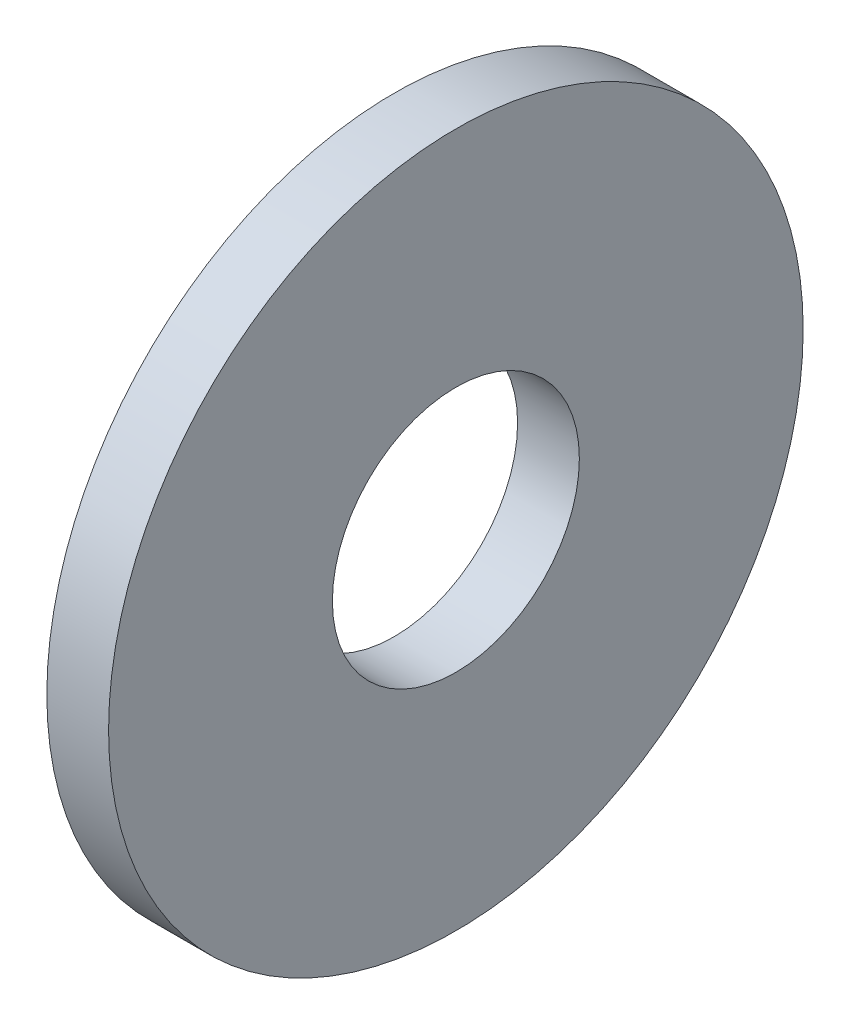
ISO-10303-21;
HEADER;
FILE_DESCRIPTION(('STEP AP214'),'2;1');
FILE_NAME('part.step','',(''),(''),'','','');
FILE_SCHEMA(('AUTOMOTIVE_DESIGN { 1 0 10303 214 1 1 1 1 }'));
ENDSEC;
DATA;
#1=APPLICATION_CONTEXT('core data for automotive mechanical design processes');
#2=APPLICATION_PROTOCOL_DEFINITION('international standard','automotive_design',2000,#1);
#3=PRODUCT_CONTEXT('',#1,'mechanical');
#4=PRODUCT('Part','Part','',(#3));
#5=PRODUCT_RELATED_PRODUCT_CATEGORY('part','',(#4));
#6=PRODUCT_DEFINITION_FORMATION('','',#4);
#7=PRODUCT_DEFINITION_CONTEXT('part definition',#1,'design');
#8=PRODUCT_DEFINITION('design','',#6,#7);
#9=PRODUCT_DEFINITION_SHAPE('','',#8);
#10=(LENGTH_UNIT() NAMED_UNIT(*) SI_UNIT(.MILLI.,.METRE.));
#11=(NAMED_UNIT(*) PLANE_ANGLE_UNIT() SI_UNIT($,.RADIAN.));
#12=(NAMED_UNIT(*) SI_UNIT($,.STERADIAN.) SOLID_ANGLE_UNIT());
#13=UNCERTAINTY_MEASURE_WITH_UNIT(LENGTH_MEASURE(1.E-05),#10,'distance_accuracy_value','');
#14=(GEOMETRIC_REPRESENTATION_CONTEXT(3) GLOBAL_UNCERTAINTY_ASSIGNED_CONTEXT((#13)) GLOBAL_UNIT_ASSIGNED_CONTEXT((#10,
#11,#12)) REPRESENTATION_CONTEXT('',''));
#15=CARTESIAN_POINT('',(0.,0.,0.));
#16=DIRECTION('',(0.,0.,1.));
#17=DIRECTION('',(1.,0.,0.));
#18=AXIS2_PLACEMENT_3D('',#15,#16,#17);
#19=CARTESIAN_POINT('',(0.,3.2,0.));
#20=DIRECTION('',(1.,0.,0.));
#21=DIRECTION('',(0.,0.,-1.));
#22=AXIS2_PLACEMENT_3D('',#19,#20,#21);
#23=PLANE('',#22);
#24=CARTESIAN_POINT('',(0.,0.,0.));
#25=DIRECTION('',(-1.,0.,0.));
#26=DIRECTION('',(0.,0.,1.));
#27=AXIS2_PLACEMENT_3D('',#24,#25,#26);
#28=CIRCLE('',#27,3.2);
#29=CARTESIAN_POINT('',(0.,0.,3.2));
#30=VERTEX_POINT('',#29);
#31=EDGE_CURVE('E51',#30,#30,#28,.T.);
#32=ORIENTED_EDGE('',*,*,#31,.F.);
#33=EDGE_LOOP('',(#32));
#34=FACE_BOUND('',#33,.T.);
#35=CARTESIAN_POINT('',(0.,0.,0.));
#36=DIRECTION('',(-1.,0.,0.));
#37=DIRECTION('',(0.,0.,1.));
#38=AXIS2_PLACEMENT_3D('',#35,#36,#37);
#39=CIRCLE('',#38,9.);
#40=CARTESIAN_POINT('',(0.,0.,9.));
#41=VERTEX_POINT('',#40);
#42=EDGE_CURVE('E10',#41,#41,#39,.T.);
#43=ORIENTED_EDGE('',*,*,#42,.T.);
#44=EDGE_LOOP('',(#43));
#45=FACE_BOUND('',#44,.T.);
#46=ADVANCED_FACE('F37',(#34,#45),#23,.F.);
#47=CARTESIAN_POINT('',(-5.,0.,0.));
#48=DIRECTION('',(-1.,0.,0.));
#49=DIRECTION('',(0.,0.,1.));
#50=AXIS2_PLACEMENT_3D('',#47,#48,#49);
#51=CYLINDRICAL_SURFACE('',#50,9.);
#52=ORIENTED_EDGE('',*,*,#42,.F.);
#53=EDGE_LOOP('',(#52));
#54=FACE_BOUND('',#53,.T.);
#55=CARTESIAN_POINT('',(1.6,0.,0.));
#56=DIRECTION('',(-1.,0.,0.));
#57=DIRECTION('',(0.,0.,1.));
#58=AXIS2_PLACEMENT_3D('',#55,#56,#57);
#59=CIRCLE('',#58,9.);
#60=CARTESIAN_POINT('',(1.6,0.,9.));
#61=VERTEX_POINT('',#60);
#62=EDGE_CURVE('E43',#61,#61,#59,.T.);
#63=ORIENTED_EDGE('',*,*,#62,.T.);
#64=EDGE_LOOP('',(#63));
#65=FACE_BOUND('',#64,.T.);
#66=ADVANCED_FACE('F60',(#54,#65),#51,.T.);
#67=CARTESIAN_POINT('',(1.6,3.2,0.));
#68=DIRECTION('',(-1.,0.,0.));
#69=DIRECTION('',(0.,0.,1.));
#70=AXIS2_PLACEMENT_3D('',#67,#68,#69);
#71=PLANE('',#70);
#72=ORIENTED_EDGE('',*,*,#62,.F.);
#73=EDGE_LOOP('',(#72));
#74=FACE_BOUND('',#73,.T.);
#75=CARTESIAN_POINT('',(1.6,0.,0.));
#76=DIRECTION('',(-1.,0.,0.));
#77=DIRECTION('',(0.,0.,1.));
#78=AXIS2_PLACEMENT_3D('',#75,#76,#77);
#79=CIRCLE('',#78,3.2);
#80=CARTESIAN_POINT('',(1.6,0.,3.2));
#81=VERTEX_POINT('',#80);
#82=EDGE_CURVE('E47',#81,#81,#79,.T.);
#83=ORIENTED_EDGE('',*,*,#82,.T.);
#84=EDGE_LOOP('',(#83));
#85=FACE_BOUND('',#84,.T.);
#86=ADVANCED_FACE('F64',(#74,#85),#71,.F.);
#87=CARTESIAN_POINT('',(-5.,0.,0.));
#88=DIRECTION('',(-1.,0.,0.));
#89=DIRECTION('',(0.,0.,1.));
#90=AXIS2_PLACEMENT_3D('',#87,#88,#89);
#91=CYLINDRICAL_SURFACE('',#90,3.2);
#92=ORIENTED_EDGE('',*,*,#82,.F.);
#93=EDGE_LOOP('',(#92));
#94=FACE_BOUND('',#93,.T.);
#95=ORIENTED_EDGE('',*,*,#31,.T.);
#96=EDGE_LOOP('',(#95));
#97=FACE_BOUND('',#96,.T.);
#98=ADVANCED_FACE('F57',(#94,#97),#91,.F.);
#99=CLOSED_SHELL('',(#46,#66,#86,#98));
#100=MANIFOLD_SOLID_BREP('B2',#99);
#101=ADVANCED_BREP_SHAPE_REPRESENTATION('',(#18,#100),#14);
#102=SHAPE_DEFINITION_REPRESENTATION(#9,#101);
ENDSEC;
END-ISO-10303-21;
